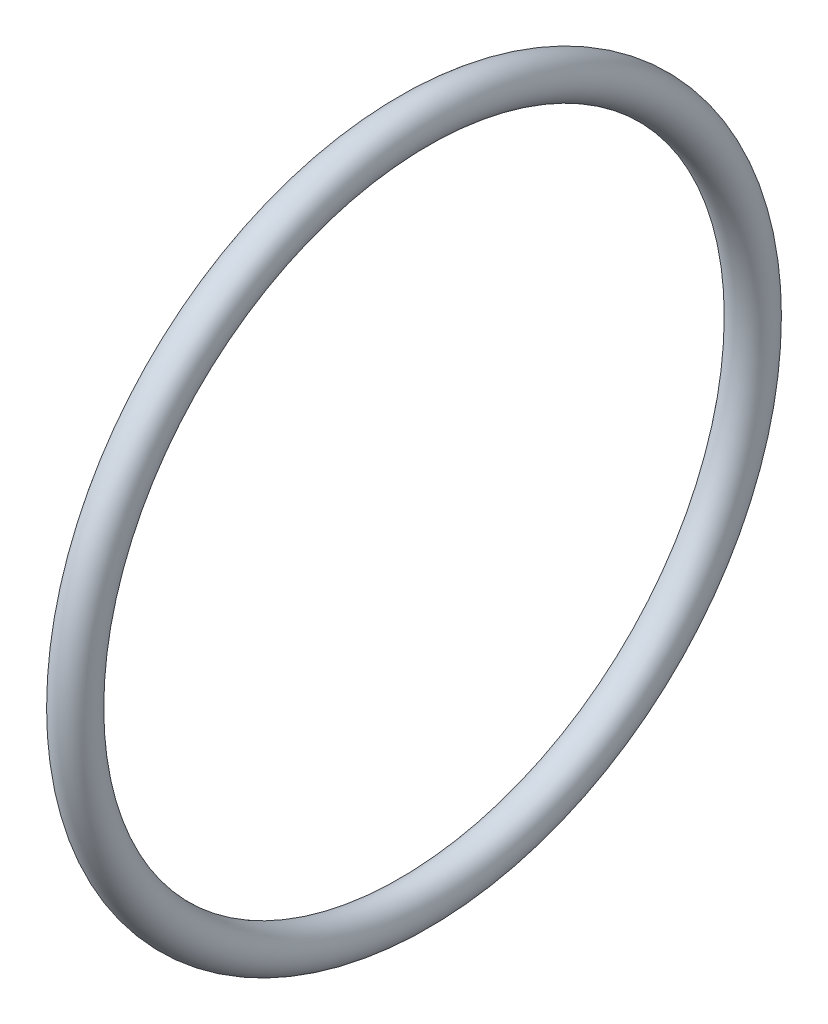
ISO-10303-21;
HEADER;
FILE_DESCRIPTION(('STEP AP214'),'2;1');
FILE_NAME('part.step','',(''),(''),'','','');
FILE_SCHEMA(('AUTOMOTIVE_DESIGN { 1 0 10303 214 1 1 1 1 }'));
ENDSEC;
DATA;
#1=APPLICATION_CONTEXT('core data for automotive mechanical design processes');
#2=APPLICATION_PROTOCOL_DEFINITION('international standard','automotive_design',2000,#1);
#3=PRODUCT_CONTEXT('',#1,'mechanical');
#4=PRODUCT('Part','Part','',(#3));
#5=PRODUCT_RELATED_PRODUCT_CATEGORY('part','',(#4));
#6=PRODUCT_DEFINITION_FORMATION('','',#4);
#7=PRODUCT_DEFINITION_CONTEXT('part definition',#1,'design');
#8=PRODUCT_DEFINITION('design','',#6,#7);
#9=PRODUCT_DEFINITION_SHAPE('','',#8);
#10=(LENGTH_UNIT() NAMED_UNIT(*) SI_UNIT(.MILLI.,.METRE.));
#11=(NAMED_UNIT(*) PLANE_ANGLE_UNIT() SI_UNIT($,.RADIAN.));
#12=(NAMED_UNIT(*) SI_UNIT($,.STERADIAN.) SOLID_ANGLE_UNIT());
#13=UNCERTAINTY_MEASURE_WITH_UNIT(LENGTH_MEASURE(1.E-05),#10,'distance_accuracy_value','');
#14=(GEOMETRIC_REPRESENTATION_CONTEXT(3) GLOBAL_UNCERTAINTY_ASSIGNED_CONTEXT((#13)) GLOBAL_UNIT_ASSIGNED_CONTEXT((#10,
#11,#12)) REPRESENTATION_CONTEXT('',''));
#15=CARTESIAN_POINT('',(0.,0.,0.));
#16=DIRECTION('',(0.,0.,1.));
#17=DIRECTION('',(1.,0.,0.));
#18=AXIS2_PLACEMENT_3D('',#15,#16,#17);
#19=CARTESIAN_POINT('',(0.,0.,0.));
#20=DIRECTION('',(-1.,0.,0.));
#21=DIRECTION('',(0.,0.,1.));
#22=AXIS2_PLACEMENT_3D('',#19,#20,#21);
#23=TOROIDAL_SURFACE('',#22,16.75,1.);
#24=CARTESIAN_POINT('',(0.,0.,17.75));
#25=VERTEX_POINT('',#24);
#26=VERTEX_LOOP('',#25);
#27=FACE_BOUND('',#26,.T.);
#28=ADVANCED_FACE('F346',(#27),#23,.T.);
#29=CLOSED_SHELL('',(#28));
#30=MANIFOLD_SOLID_BREP('B2',#29);
#31=ADVANCED_BREP_SHAPE_REPRESENTATION('',(#18,#30),#14);
#32=SHAPE_DEFINITION_REPRESENTATION(#9,#31);
ENDSEC;
END-ISO-10303-21;
